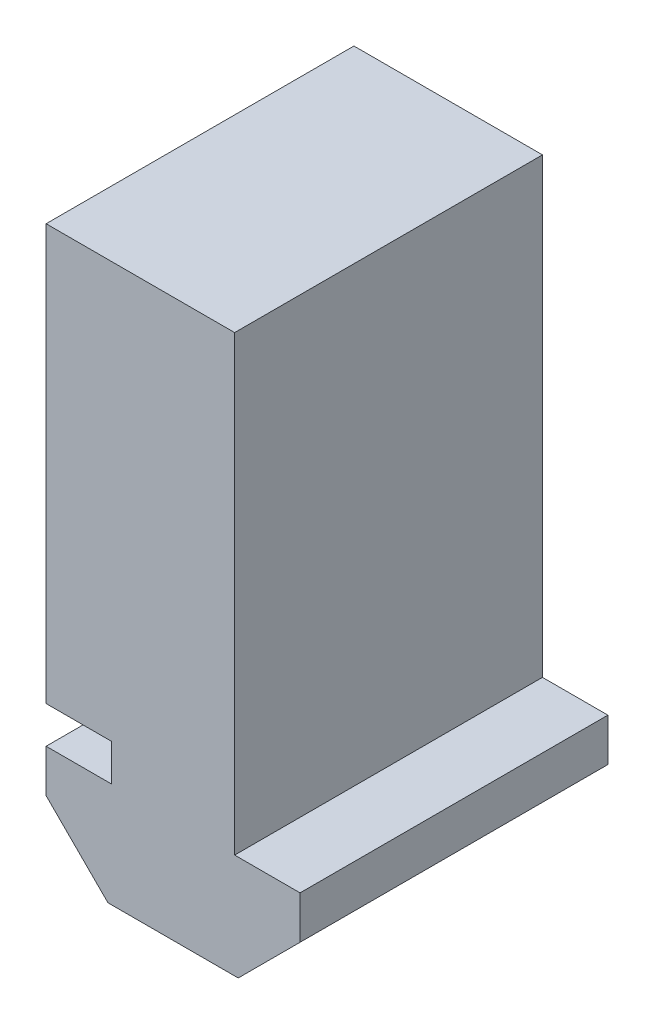
ISO-10303-21;
HEADER;
FILE_DESCRIPTION(('STEP AP214'),'2;1');
FILE_NAME('part.step','',(''),(''),'','','');
FILE_SCHEMA(('AUTOMOTIVE_DESIGN { 1 0 10303 214 1 1 1 1 }'));
ENDSEC;
DATA;
#1=APPLICATION_CONTEXT('core data for automotive mechanical design processes');
#2=APPLICATION_PROTOCOL_DEFINITION('international standard','automotive_design',2000,#1);
#3=PRODUCT_CONTEXT('',#1,'mechanical');
#4=PRODUCT('Part','Part','',(#3));
#5=PRODUCT_RELATED_PRODUCT_CATEGORY('part','',(#4));
#6=PRODUCT_DEFINITION_FORMATION('','',#4);
#7=PRODUCT_DEFINITION_CONTEXT('part definition',#1,'design');
#8=PRODUCT_DEFINITION('design','',#6,#7);
#9=PRODUCT_DEFINITION_SHAPE('','',#8);
#10=(LENGTH_UNIT() NAMED_UNIT(*) SI_UNIT(.MILLI.,.METRE.));
#11=(NAMED_UNIT(*) PLANE_ANGLE_UNIT() SI_UNIT($,.RADIAN.));
#12=(NAMED_UNIT(*) SI_UNIT($,.STERADIAN.) SOLID_ANGLE_UNIT());
#13=UNCERTAINTY_MEASURE_WITH_UNIT(LENGTH_MEASURE(1.E-05),#10,'distance_accuracy_value','');
#14=(GEOMETRIC_REPRESENTATION_CONTEXT(3) GLOBAL_UNCERTAINTY_ASSIGNED_CONTEXT((#13)) GLOBAL_UNIT_ASSIGNED_CONTEXT((#10,
#11,#12)) REPRESENTATION_CONTEXT('',''));
#15=CARTESIAN_POINT('',(0.,0.,0.));
#16=DIRECTION('',(0.,0.,1.));
#17=DIRECTION('',(1.,0.,0.));
#18=AXIS2_PLACEMENT_3D('',#15,#16,#17);
#19=CARTESIAN_POINT('',(-8.25000000000227,9.2,-20.));
#20=DIRECTION('',(-1.,0.,0.));
#21=DIRECTION('',(0.,-1.,0.));
#22=AXIS2_PLACEMENT_3D('',#19,#20,#21);
#23=PLANE('',#22);
#24=DIRECTION('',(0.,-1.,0.));
#25=VECTOR('',#24,1.);
#26=CARTESIAN_POINT('',(-8.25000000000227,9.2,0.));
#27=LINE('',#26,#25);
#28=CARTESIAN_POINT('',(-8.25000000000227,36.2,0.));
#29=VERTEX_POINT('',#28);
#30=CARTESIAN_POINT('',(-8.25000000000227,9.2,0.));
#31=VERTEX_POINT('',#30);
#32=EDGE_CURVE('E156',#29,#31,#27,.T.);
#33=ORIENTED_EDGE('',*,*,#32,.F.);
#34=DIRECTION('',(0.,0.,1.));
#35=VECTOR('',#34,1.);
#36=CARTESIAN_POINT('',(-8.25000000000227,36.2,-20.));
#37=LINE('',#36,#35);
#38=CARTESIAN_POINT('',(-8.25000000000227,36.2,-20.));
#39=VERTEX_POINT('',#38);
#40=EDGE_CURVE('E11',#39,#29,#37,.T.);
#41=ORIENTED_EDGE('',*,*,#40,.F.);
#42=DIRECTION('',(0.,-1.,0.));
#43=VECTOR('',#42,1.);
#44=CARTESIAN_POINT('',(-8.25000000000227,9.2,-20.));
#45=LINE('',#44,#43);
#46=CARTESIAN_POINT('',(-8.25000000000227,9.2,-20.));
#47=VERTEX_POINT('',#46);
#48=EDGE_CURVE('E188',#39,#47,#45,.T.);
#49=ORIENTED_EDGE('',*,*,#48,.T.);
#50=DIRECTION('',(0.,0.,1.));
#51=VECTOR('',#50,1.);
#52=CARTESIAN_POINT('',(-8.25000000000227,9.2,-20.));
#53=LINE('',#52,#51);
#54=EDGE_CURVE('E38',#47,#31,#53,.T.);
#55=ORIENTED_EDGE('',*,*,#54,.T.);
#56=EDGE_LOOP('',(#33,#41,#49,#55));
#57=FACE_BOUND('',#56,.T.);
#58=ADVANCED_FACE('F35',(#57),#23,.T.);
#59=CARTESIAN_POINT('',(-8.25000000000227,36.2,-20.));
#60=DIRECTION('',(0.,1.,0.));
#61=DIRECTION('',(0.,0.,1.));
#62=AXIS2_PLACEMENT_3D('',#59,#60,#61);
#63=PLANE('',#62);
#64=DIRECTION('',(-1.,0.,0.));
#65=VECTOR('',#64,1.);
#66=CARTESIAN_POINT('',(-8.25000000000227,36.2,0.));
#67=LINE('',#66,#65);
#68=CARTESIAN_POINT('',(4.00000000000456,36.2,0.));
#69=VERTEX_POINT('',#68);
#70=EDGE_CURVE('E186',#69,#29,#67,.T.);
#71=ORIENTED_EDGE('',*,*,#70,.F.);
#72=DIRECTION('',(0.,0.,1.));
#73=VECTOR('',#72,1.);
#74=CARTESIAN_POINT('',(4.00000000000456,36.2,-20.));
#75=LINE('',#74,#73);
#76=CARTESIAN_POINT('',(4.00000000000456,36.2,-20.));
#77=VERTEX_POINT('',#76);
#78=EDGE_CURVE('E44',#77,#69,#75,.T.);
#79=ORIENTED_EDGE('',*,*,#78,.F.);
#80=DIRECTION('',(-1.,0.,0.));
#81=VECTOR('',#80,1.);
#82=CARTESIAN_POINT('',(-8.25000000000227,36.2,-20.));
#83=LINE('',#82,#81);
#84=EDGE_CURVE('E146',#77,#39,#83,.T.);
#85=ORIENTED_EDGE('',*,*,#84,.T.);
#86=ORIENTED_EDGE('',*,*,#40,.T.);
#87=EDGE_LOOP('',(#71,#79,#85,#86));
#88=FACE_BOUND('',#87,.T.);
#89=ADVANCED_FACE('F208',(#88),#63,.T.);
#90=CARTESIAN_POINT('',(4.00000000000456,36.2,-20.));
#91=DIRECTION('',(1.,0.,0.));
#92=DIRECTION('',(0.,0.,-1.));
#93=AXIS2_PLACEMENT_3D('',#90,#91,#92);
#94=PLANE('',#93);
#95=DIRECTION('',(0.,1.,0.));
#96=VECTOR('',#95,1.);
#97=CARTESIAN_POINT('',(4.00000000000456,36.2,0.));
#98=LINE('',#97,#96);
#99=CARTESIAN_POINT('',(4.00000000000461,6.8,0.));
#100=VERTEX_POINT('',#99);
#101=EDGE_CURVE('E132',#100,#69,#98,.T.);
#102=ORIENTED_EDGE('',*,*,#101,.F.);
#103=DIRECTION('',(0.,0.,1.));
#104=VECTOR('',#103,1.);
#105=CARTESIAN_POINT('',(4.00000000000461,6.8,-20.));
#106=LINE('',#105,#104);
#107=CARTESIAN_POINT('',(4.00000000000461,6.8,-20.));
#108=VERTEX_POINT('',#107);
#109=EDGE_CURVE('E128',#108,#100,#106,.T.);
#110=ORIENTED_EDGE('',*,*,#109,.F.);
#111=DIRECTION('',(0.,1.,0.));
#112=VECTOR('',#111,1.);
#113=CARTESIAN_POINT('',(4.00000000000456,9.2,-20.));
#114=LINE('',#113,#112);
#115=EDGE_CURVE('E131',#108,#77,#114,.T.);
#116=ORIENTED_EDGE('',*,*,#115,.T.);
#117=ORIENTED_EDGE('',*,*,#78,.T.);
#118=EDGE_LOOP('',(#102,#110,#116,#117));
#119=FACE_BOUND('',#118,.T.);
#120=ADVANCED_FACE('F130',(#119),#94,.T.);
#121=CARTESIAN_POINT('',(4.00000000000461,6.8,-20.));
#122=DIRECTION('',(0.,1.,0.));
#123=DIRECTION('',(0.,0.,1.));
#124=AXIS2_PLACEMENT_3D('',#121,#122,#123);
#125=PLANE('',#124);
#126=DIRECTION('',(-1.,0.,0.));
#127=VECTOR('',#126,1.);
#128=CARTESIAN_POINT('',(4.00000000000461,6.8,0.));
#129=LINE('',#128,#127);
#130=CARTESIAN_POINT('',(8.25000000000231,6.8,0.));
#131=VERTEX_POINT('',#130);
#132=EDGE_CURVE('E183',#131,#100,#129,.T.);
#133=ORIENTED_EDGE('',*,*,#132,.F.);
#134=DIRECTION('',(0.,0.,1.));
#135=VECTOR('',#134,1.);
#136=CARTESIAN_POINT('',(8.25000000000231,6.8,-20.));
#137=LINE('',#136,#135);
#138=CARTESIAN_POINT('',(8.25000000000231,6.8,-20.));
#139=VERTEX_POINT('',#138);
#140=EDGE_CURVE('E137',#139,#131,#137,.T.);
#141=ORIENTED_EDGE('',*,*,#140,.F.);
#142=DIRECTION('',(-1.,0.,0.));
#143=VECTOR('',#142,1.);
#144=CARTESIAN_POINT('',(4.00000000000461,6.8,-20.));
#145=LINE('',#144,#143);
#146=EDGE_CURVE('E144',#139,#108,#145,.T.);
#147=ORIENTED_EDGE('',*,*,#146,.T.);
#148=ORIENTED_EDGE('',*,*,#109,.T.);
#149=EDGE_LOOP('',(#133,#141,#147,#148));
#150=FACE_BOUND('',#149,.T.);
#151=ADVANCED_FACE('F148',(#150),#125,.T.);
#152=CARTESIAN_POINT('',(8.25000000000231,6.8,-20.));
#153=DIRECTION('',(1.,0.,0.));
#154=DIRECTION('',(0.,0.,-1.));
#155=AXIS2_PLACEMENT_3D('',#152,#153,#154);
#156=PLANE('',#155);
#157=DIRECTION('',(0.,1.,0.));
#158=VECTOR('',#157,1.);
#159=CARTESIAN_POINT('',(8.25000000000231,6.8,0.));
#160=LINE('',#159,#158);
#161=CARTESIAN_POINT('',(8.25000000000231,4.01776695296648,0.));
#162=VERTEX_POINT('',#161);
#163=EDGE_CURVE('E180',#162,#131,#160,.T.);
#164=ORIENTED_EDGE('',*,*,#163,.F.);
#165=DIRECTION('',(0.,0.,1.));
#166=VECTOR('',#165,1.);
#167=CARTESIAN_POINT('',(8.25000000000231,4.01776695296648,-20.));
#168=LINE('',#167,#166);
#169=CARTESIAN_POINT('',(8.25000000000231,4.01776695296648,-20.));
#170=VERTEX_POINT('',#169);
#171=EDGE_CURVE('E192',#170,#162,#168,.T.);
#172=ORIENTED_EDGE('',*,*,#171,.F.);
#173=DIRECTION('',(0.,1.,0.));
#174=VECTOR('',#173,1.);
#175=CARTESIAN_POINT('',(8.25000000000231,6.8,-20.));
#176=LINE('',#175,#174);
#177=EDGE_CURVE('E149',#170,#139,#176,.T.);
#178=ORIENTED_EDGE('',*,*,#177,.T.);
#179=ORIENTED_EDGE('',*,*,#140,.T.);
#180=EDGE_LOOP('',(#164,#172,#178,#179));
#181=FACE_BOUND('',#180,.T.);
#182=ADVANCED_FACE('F221',(#181),#156,.T.);
#183=CARTESIAN_POINT('',(8.25000000000231,4.01776695296648,-20.));
#184=DIRECTION('',(0.707106781186548,-0.707106781186548,0.));
#185=DIRECTION('',(0.707106781186548,0.707106781186548,0.));
#186=AXIS2_PLACEMENT_3D('',#183,#184,#185);
#187=PLANE('',#186);
#188=DIRECTION('',(0.707106781186548,0.707106781186548,0.));
#189=VECTOR('',#188,1.);
#190=CARTESIAN_POINT('',(8.25000000000231,4.01776695296648,0.));
#191=LINE('',#190,#189);
#192=CARTESIAN_POINT('',(4.23223304703582,0.,0.));
#193=VERTEX_POINT('',#192);
#194=EDGE_CURVE('E177',#193,#162,#191,.T.);
#195=ORIENTED_EDGE('',*,*,#194,.F.);
#196=DIRECTION('',(0.,0.,1.));
#197=VECTOR('',#196,1.);
#198=CARTESIAN_POINT('',(4.23223304703582,0.,-20.));
#199=LINE('',#198,#197);
#200=CARTESIAN_POINT('',(4.23223304703582,0.,-20.));
#201=VERTEX_POINT('',#200);
#202=EDGE_CURVE('E194',#201,#193,#199,.T.);
#203=ORIENTED_EDGE('',*,*,#202,.F.);
#204=DIRECTION('',(0.707106781186548,0.707106781186548,0.));
#205=VECTOR('',#204,1.);
#206=CARTESIAN_POINT('',(8.25000000000231,4.01776695296648,-20.));
#207=LINE('',#206,#205);
#208=EDGE_CURVE('E151',#201,#170,#207,.T.);
#209=ORIENTED_EDGE('',*,*,#208,.T.);
#210=ORIENTED_EDGE('',*,*,#171,.T.);
#211=EDGE_LOOP('',(#195,#203,#209,#210));
#212=FACE_BOUND('',#211,.T.);
#213=ADVANCED_FACE('F224',(#212),#187,.T.);
#214=CARTESIAN_POINT('',(-4.23223304703582,0.,-20.));
#215=DIRECTION('',(0.,-1.,0.));
#216=DIRECTION('',(1.,0.,0.));
#217=AXIS2_PLACEMENT_3D('',#214,#215,#216);
#218=PLANE('',#217);
#219=DIRECTION('',(1.,0.,0.));
#220=VECTOR('',#219,1.);
#221=CARTESIAN_POINT('',(-4.23223304703582,0.,0.));
#222=LINE('',#221,#220);
#223=CARTESIAN_POINT('',(-4.23223304703582,0.,0.));
#224=VERTEX_POINT('',#223);
#225=EDGE_CURVE('E174',#224,#193,#222,.T.);
#226=ORIENTED_EDGE('',*,*,#225,.F.);
#227=DIRECTION('',(0.,0.,1.));
#228=VECTOR('',#227,1.);
#229=CARTESIAN_POINT('',(-4.23223304703582,0.,-20.));
#230=LINE('',#229,#228);
#231=CARTESIAN_POINT('',(-4.23223304703582,0.,-20.));
#232=VERTEX_POINT('',#231);
#233=EDGE_CURVE('E196',#232,#224,#230,.T.);
#234=ORIENTED_EDGE('',*,*,#233,.F.);
#235=DIRECTION('',(1.,0.,0.));
#236=VECTOR('',#235,1.);
#237=CARTESIAN_POINT('',(-4.23223304703582,0.,-20.));
#238=LINE('',#237,#236);
#239=EDGE_CURVE('E353',#232,#201,#238,.T.);
#240=ORIENTED_EDGE('',*,*,#239,.T.);
#241=ORIENTED_EDGE('',*,*,#202,.T.);
#242=EDGE_LOOP('',(#226,#234,#240,#241));
#243=FACE_BOUND('',#242,.T.);
#244=ADVANCED_FACE('F228',(#243),#218,.T.);
#245=CARTESIAN_POINT('',(-8.25000000000227,4.01776695296648,-20.));
#246=DIRECTION('',(-0.707106781186551,-0.707106781186544,0.));
#247=DIRECTION('',(0.707106781186544,-0.707106781186551,0.));
#248=AXIS2_PLACEMENT_3D('',#245,#246,#247);
#249=PLANE('',#248);
#250=DIRECTION('',(0.707106781186544,-0.707106781186551,0.));
#251=VECTOR('',#250,1.);
#252=CARTESIAN_POINT('',(-8.25000000000227,4.01776695296648,0.));
#253=LINE('',#252,#251);
#254=CARTESIAN_POINT('',(-8.25000000000227,4.01776695296648,0.));
#255=VERTEX_POINT('',#254);
#256=EDGE_CURVE('E171',#255,#224,#253,.T.);
#257=ORIENTED_EDGE('',*,*,#256,.F.);
#258=DIRECTION('',(0.,0.,1.));
#259=VECTOR('',#258,1.);
#260=CARTESIAN_POINT('',(-8.25000000000227,4.01776695296648,-20.));
#261=LINE('',#260,#259);
#262=CARTESIAN_POINT('',(-8.25000000000227,4.01776695296648,-20.));
#263=VERTEX_POINT('',#262);
#264=EDGE_CURVE('E198',#263,#255,#261,.T.);
#265=ORIENTED_EDGE('',*,*,#264,.F.);
#266=DIRECTION('',(0.707106781186544,-0.707106781186551,0.));
#267=VECTOR('',#266,1.);
#268=CARTESIAN_POINT('',(-8.25000000000227,4.01776695296648,-20.));
#269=LINE('',#268,#267);
#270=EDGE_CURVE('E357',#263,#232,#269,.T.);
#271=ORIENTED_EDGE('',*,*,#270,.T.);
#272=ORIENTED_EDGE('',*,*,#233,.T.);
#273=EDGE_LOOP('',(#257,#265,#271,#272));
#274=FACE_BOUND('',#273,.T.);
#275=ADVANCED_FACE('F232',(#274),#249,.T.);
#276=CARTESIAN_POINT('',(-8.25000000000231,6.8,-20.));
#277=DIRECTION('',(-1.,0.,0.));
#278=DIRECTION('',(0.,-1.,0.));
#279=AXIS2_PLACEMENT_3D('',#276,#277,#278);
#280=PLANE('',#279);
#281=DIRECTION('',(0.,-1.,0.));
#282=VECTOR('',#281,1.);
#283=CARTESIAN_POINT('',(-8.25000000000231,6.8,0.));
#284=LINE('',#283,#282);
#285=CARTESIAN_POINT('',(-8.25000000000231,6.8,0.));
#286=VERTEX_POINT('',#285);
#287=EDGE_CURVE('E168',#286,#255,#284,.T.);
#288=ORIENTED_EDGE('',*,*,#287,.F.);
#289=DIRECTION('',(0.,0.,1.));
#290=VECTOR('',#289,1.);
#291=CARTESIAN_POINT('',(-8.25000000000231,6.8,-20.));
#292=LINE('',#291,#290);
#293=CARTESIAN_POINT('',(-8.25000000000231,6.8,-20.));
#294=VERTEX_POINT('',#293);
#295=EDGE_CURVE('E200',#294,#286,#292,.T.);
#296=ORIENTED_EDGE('',*,*,#295,.F.);
#297=DIRECTION('',(0.,-1.,0.));
#298=VECTOR('',#297,1.);
#299=CARTESIAN_POINT('',(-8.25000000000231,6.8,-20.));
#300=LINE('',#299,#298);
#301=EDGE_CURVE('E346',#294,#263,#300,.T.);
#302=ORIENTED_EDGE('',*,*,#301,.T.);
#303=ORIENTED_EDGE('',*,*,#264,.T.);
#304=EDGE_LOOP('',(#288,#296,#302,#303));
#305=FACE_BOUND('',#304,.T.);
#306=ADVANCED_FACE('F236',(#305),#280,.T.);
#307=CARTESIAN_POINT('',(-4.00000000000454,6.8,-20.));
#308=DIRECTION('',(0.,1.,0.));
#309=DIRECTION('',(0.,0.,1.));
#310=AXIS2_PLACEMENT_3D('',#307,#308,#309);
#311=PLANE('',#310);
#312=DIRECTION('',(-1.,0.,0.));
#313=VECTOR('',#312,1.);
#314=CARTESIAN_POINT('',(-4.00000000000454,6.8,0.));
#315=LINE('',#314,#313);
#316=CARTESIAN_POINT('',(-4.00000000000454,6.8,0.));
#317=VERTEX_POINT('',#316);
#318=EDGE_CURVE('E165',#317,#286,#315,.T.);
#319=ORIENTED_EDGE('',*,*,#318,.F.);
#320=DIRECTION('',(0.,0.,1.));
#321=VECTOR('',#320,1.);
#322=CARTESIAN_POINT('',(-4.00000000000454,6.8,-20.));
#323=LINE('',#322,#321);
#324=CARTESIAN_POINT('',(-4.00000000000454,6.8,-20.));
#325=VERTEX_POINT('',#324);
#326=EDGE_CURVE('E202',#325,#317,#323,.T.);
#327=ORIENTED_EDGE('',*,*,#326,.F.);
#328=DIRECTION('',(-1.,0.,0.));
#329=VECTOR('',#328,1.);
#330=CARTESIAN_POINT('',(-4.00000000000454,6.8,-20.));
#331=LINE('',#330,#329);
#332=EDGE_CURVE('E342',#325,#294,#331,.T.);
#333=ORIENTED_EDGE('',*,*,#332,.T.);
#334=ORIENTED_EDGE('',*,*,#295,.T.);
#335=EDGE_LOOP('',(#319,#327,#333,#334));
#336=FACE_BOUND('',#335,.T.);
#337=ADVANCED_FACE('F240',(#336),#311,.T.);
#338=CARTESIAN_POINT('',(-4.00000000000456,9.2,-20.));
#339=DIRECTION('',(-1.,0.,0.));
#340=DIRECTION('',(0.,-1.,0.));
#341=AXIS2_PLACEMENT_3D('',#338,#339,#340);
#342=PLANE('',#341);
#343=DIRECTION('',(0.,-1.,0.));
#344=VECTOR('',#343,1.);
#345=CARTESIAN_POINT('',(-4.00000000000456,9.2,0.));
#346=LINE('',#345,#344);
#347=CARTESIAN_POINT('',(-4.00000000000456,9.2,0.));
#348=VERTEX_POINT('',#347);
#349=EDGE_CURVE('E162',#348,#317,#346,.T.);
#350=ORIENTED_EDGE('',*,*,#349,.F.);
#351=DIRECTION('',(0.,0.,1.));
#352=VECTOR('',#351,1.);
#353=CARTESIAN_POINT('',(-4.00000000000456,9.2,-20.));
#354=LINE('',#353,#352);
#355=CARTESIAN_POINT('',(-4.00000000000456,9.2,-20.));
#356=VERTEX_POINT('',#355);
#357=EDGE_CURVE('E203',#356,#348,#354,.T.);
#358=ORIENTED_EDGE('',*,*,#357,.F.);
#359=DIRECTION('',(0.,-1.,0.));
#360=VECTOR('',#359,1.);
#361=CARTESIAN_POINT('',(-4.00000000000456,9.2,-20.));
#362=LINE('',#361,#360);
#363=EDGE_CURVE('E363',#356,#325,#362,.T.);
#364=ORIENTED_EDGE('',*,*,#363,.T.);
#365=ORIENTED_EDGE('',*,*,#326,.T.);
#366=EDGE_LOOP('',(#350,#358,#364,#365));
#367=FACE_BOUND('',#366,.T.);
#368=ADVANCED_FACE('F244',(#367),#342,.T.);
#369=CARTESIAN_POINT('',(-4.00000000000456,9.2,-20.));
#370=DIRECTION('',(0.,-1.,0.));
#371=DIRECTION('',(0.,0.,-1.));
#372=AXIS2_PLACEMENT_3D('',#369,#370,#371);
#373=PLANE('',#372);
#374=DIRECTION('',(1.,0.,0.));
#375=VECTOR('',#374,1.);
#376=CARTESIAN_POINT('',(-4.00000000000456,9.2,0.));
#377=LINE('',#376,#375);
#378=EDGE_CURVE('E159',#31,#348,#377,.T.);
#379=ORIENTED_EDGE('',*,*,#378,.F.);
#380=ORIENTED_EDGE('',*,*,#54,.F.);
#381=DIRECTION('',(1.,0.,0.));
#382=VECTOR('',#381,1.);
#383=CARTESIAN_POINT('',(-4.00000000000456,9.2,-20.));
#384=LINE('',#383,#382);
#385=EDGE_CURVE('E365',#47,#356,#384,.T.);
#386=ORIENTED_EDGE('',*,*,#385,.T.);
#387=ORIENTED_EDGE('',*,*,#357,.T.);
#388=EDGE_LOOP('',(#379,#380,#386,#387));
#389=FACE_BOUND('',#388,.T.);
#390=ADVANCED_FACE('F205',(#389),#373,.T.);
#391=CARTESIAN_POINT('',(0.,0.,-20.));
#392=DIRECTION('',(0.,0.,-1.));
#393=DIRECTION('',(-1.,0.,0.));
#394=AXIS2_PLACEMENT_3D('',#391,#392,#393);
#395=PLANE('',#394);
#396=ORIENTED_EDGE('',*,*,#48,.F.);
#397=ORIENTED_EDGE('',*,*,#84,.F.);
#398=ORIENTED_EDGE('',*,*,#115,.F.);
#399=ORIENTED_EDGE('',*,*,#146,.F.);
#400=ORIENTED_EDGE('',*,*,#177,.F.);
#401=ORIENTED_EDGE('',*,*,#208,.F.);
#402=ORIENTED_EDGE('',*,*,#239,.F.);
#403=ORIENTED_EDGE('',*,*,#270,.F.);
#404=ORIENTED_EDGE('',*,*,#301,.F.);
#405=ORIENTED_EDGE('',*,*,#332,.F.);
#406=ORIENTED_EDGE('',*,*,#363,.F.);
#407=ORIENTED_EDGE('',*,*,#385,.F.);
#408=EDGE_LOOP('',(#396,#397,#398,#399,#400,#401,#402,#403,#404,#405,#406,#407));
#409=FACE_BOUND('',#408,.T.);
#410=ADVANCED_FACE('F142',(#409),#395,.T.);
#411=CARTESIAN_POINT('',(0.,0.,0.));
#412=DIRECTION('',(0.,0.,-1.));
#413=DIRECTION('',(-1.,0.,0.));
#414=AXIS2_PLACEMENT_3D('',#411,#412,#413);
#415=PLANE('',#414);
#416=ORIENTED_EDGE('',*,*,#32,.T.);
#417=ORIENTED_EDGE('',*,*,#378,.T.);
#418=ORIENTED_EDGE('',*,*,#349,.T.);
#419=ORIENTED_EDGE('',*,*,#318,.T.);
#420=ORIENTED_EDGE('',*,*,#287,.T.);
#421=ORIENTED_EDGE('',*,*,#256,.T.);
#422=ORIENTED_EDGE('',*,*,#225,.T.);
#423=ORIENTED_EDGE('',*,*,#194,.T.);
#424=ORIENTED_EDGE('',*,*,#163,.T.);
#425=ORIENTED_EDGE('',*,*,#132,.T.);
#426=ORIENTED_EDGE('',*,*,#101,.T.);
#427=ORIENTED_EDGE('',*,*,#70,.T.);
#428=EDGE_LOOP('',(#416,#417,#418,#419,#420,#421,#422,#423,#424,#425,#426,#427));
#429=FACE_BOUND('',#428,.T.);
#430=ADVANCED_FACE('F207',(#429),#415,.F.);
#431=CLOSED_SHELL('',(#58,#89,#120,#151,#182,#213,#244,#275,#306,#337,#368,#390,#410,#430));
#432=MANIFOLD_SOLID_BREP('B2',#431);
#433=ADVANCED_BREP_SHAPE_REPRESENTATION('',(#18,#432),#14);
#434=SHAPE_DEFINITION_REPRESENTATION(#9,#433);
ENDSEC;
END-ISO-10303-21;
